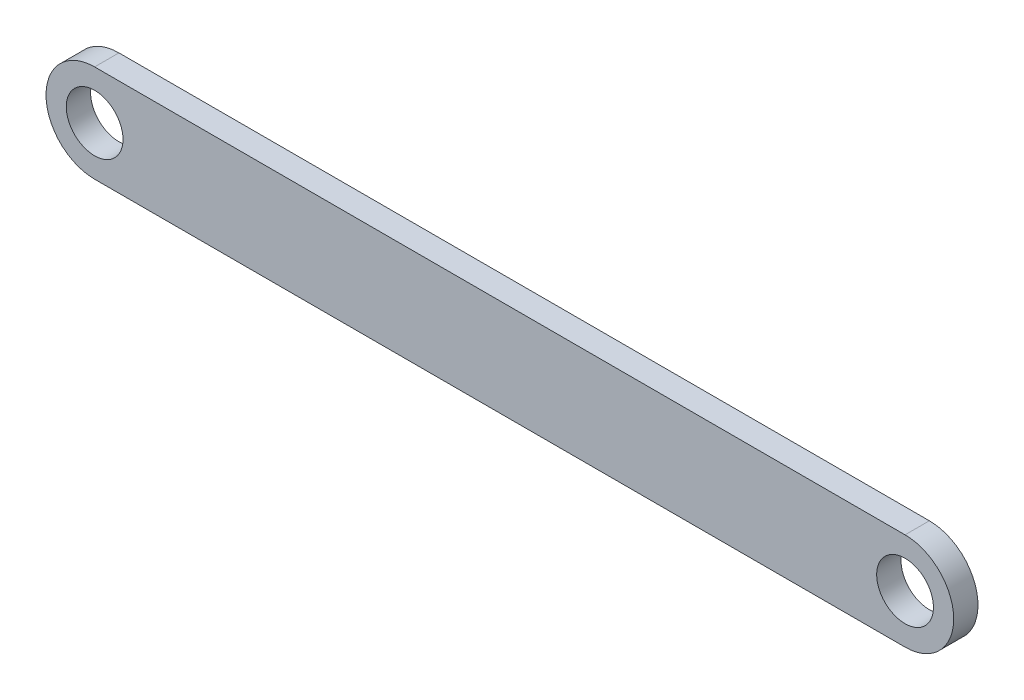
ISO-10303-21;
HEADER;
FILE_DESCRIPTION(('STEP AP214'),'2;1');
FILE_NAME('part.step','',(''),(''),'','','');
FILE_SCHEMA(('AUTOMOTIVE_DESIGN { 1 0 10303 214 1 1 1 1 }'));
ENDSEC;
DATA;
#1=APPLICATION_CONTEXT('core data for automotive mechanical design processes');
#2=APPLICATION_PROTOCOL_DEFINITION('international standard','automotive_design',2000,#1);
#3=PRODUCT_CONTEXT('',#1,'mechanical');
#4=PRODUCT('Part','Part','',(#3));
#5=PRODUCT_RELATED_PRODUCT_CATEGORY('part','',(#4));
#6=PRODUCT_DEFINITION_FORMATION('','',#4);
#7=PRODUCT_DEFINITION_CONTEXT('part definition',#1,'design');
#8=PRODUCT_DEFINITION('design','',#6,#7);
#9=PRODUCT_DEFINITION_SHAPE('','',#8);
#10=(LENGTH_UNIT() NAMED_UNIT(*) SI_UNIT(.MILLI.,.METRE.));
#11=(NAMED_UNIT(*) PLANE_ANGLE_UNIT() SI_UNIT($,.RADIAN.));
#12=(NAMED_UNIT(*) SI_UNIT($,.STERADIAN.) SOLID_ANGLE_UNIT());
#13=UNCERTAINTY_MEASURE_WITH_UNIT(LENGTH_MEASURE(1.E-05),#10,'distance_accuracy_value','');
#14=(GEOMETRIC_REPRESENTATION_CONTEXT(3) GLOBAL_UNCERTAINTY_ASSIGNED_CONTEXT((#13)) GLOBAL_UNIT_ASSIGNED_CONTEXT((#10,
#11,#12)) REPRESENTATION_CONTEXT('',''));
#15=CARTESIAN_POINT('',(0.,0.,0.));
#16=DIRECTION('',(0.,0.,1.));
#17=DIRECTION('',(1.,0.,0.));
#18=AXIS2_PLACEMENT_3D('',#15,#16,#17);
#19=CARTESIAN_POINT('',(-50.,0.,3.));
#20=DIRECTION('',(0.,0.,1.));
#21=DIRECTION('',(1.,0.,0.));
#22=AXIS2_PLACEMENT_3D('',#19,#20,#21);
#23=PLANE('',#22);
#24=CARTESIAN_POINT('',(50.,0.,3.));
#25=DIRECTION('',(0.,0.,1.));
#26=DIRECTION('',(1.,0.,0.));
#27=AXIS2_PLACEMENT_3D('',#24,#25,#26);
#28=CIRCLE('',#27,3.5);
#29=CARTESIAN_POINT('',(53.5,0.,3.));
#30=VERTEX_POINT('',#29);
#31=EDGE_CURVE('E100',#30,#30,#28,.T.);
#32=ORIENTED_EDGE('',*,*,#31,.F.);
#33=EDGE_LOOP('',(#32));
#34=FACE_BOUND('',#33,.T.);
#35=CARTESIAN_POINT('',(-50.,0.,3.));
#36=DIRECTION('',(0.,0.,1.));
#37=DIRECTION('',(1.,0.,0.));
#38=AXIS2_PLACEMENT_3D('',#35,#36,#37);
#39=CIRCLE('',#38,6.00000000000002);
#40=CARTESIAN_POINT('',(-50.,6.00000000000002,3.));
#41=VERTEX_POINT('',#40);
#42=CARTESIAN_POINT('',(-50.,-6.00000000000002,3.));
#43=VERTEX_POINT('',#42);
#44=EDGE_CURVE('E85',#41,#43,#39,.T.);
#45=ORIENTED_EDGE('',*,*,#44,.T.);
#46=DIRECTION('',(1.,0.,0.));
#47=VECTOR('',#46,1.);
#48=CARTESIAN_POINT('',(-50.,-6.00000000000002,3.));
#49=LINE('',#48,#47);
#50=CARTESIAN_POINT('',(50.,-6.00000000000002,3.));
#51=VERTEX_POINT('',#50);
#52=EDGE_CURVE('E80',#43,#51,#49,.T.);
#53=ORIENTED_EDGE('',*,*,#52,.T.);
#54=CARTESIAN_POINT('',(50.,0.,3.));
#55=DIRECTION('',(0.,0.,1.));
#56=DIRECTION('',(1.,0.,0.));
#57=AXIS2_PLACEMENT_3D('',#54,#55,#56);
#58=CIRCLE('',#57,6.00000000000002);
#59=CARTESIAN_POINT('',(50.,6.00000000000002,3.));
#60=VERTEX_POINT('',#59);
#61=EDGE_CURVE('E83',#51,#60,#58,.T.);
#62=ORIENTED_EDGE('',*,*,#61,.T.);
#63=DIRECTION('',(-1.,0.,0.));
#64=VECTOR('',#63,1.);
#65=CARTESIAN_POINT('',(-50.,6.00000000000002,3.));
#66=LINE('',#65,#64);
#67=EDGE_CURVE('E50',#60,#41,#66,.T.);
#68=ORIENTED_EDGE('',*,*,#67,.T.);
#69=EDGE_LOOP('',(#45,#53,#62,#68));
#70=FACE_BOUND('',#69,.T.);
#71=CARTESIAN_POINT('',(-50.,0.,3.));
#72=DIRECTION('',(0.,0.,1.));
#73=DIRECTION('',(1.,0.,0.));
#74=AXIS2_PLACEMENT_3D('',#71,#72,#73);
#75=CIRCLE('',#74,3.5);
#76=CARTESIAN_POINT('',(-46.5,0.,3.));
#77=VERTEX_POINT('',#76);
#78=EDGE_CURVE('E115',#77,#77,#75,.T.);
#79=ORIENTED_EDGE('',*,*,#78,.F.);
#80=EDGE_LOOP('',(#79));
#81=FACE_BOUND('',#80,.T.);
#82=ADVANCED_FACE('F33',(#34,#70,#81),#23,.T.);
#83=CARTESIAN_POINT('',(-50.,0.,0.));
#84=DIRECTION('',(0.,0.,1.));
#85=DIRECTION('',(1.,0.,0.));
#86=AXIS2_PLACEMENT_3D('',#83,#84,#85);
#87=PLANE('',#86);
#88=CARTESIAN_POINT('',(-50.,0.,0.));
#89=DIRECTION('',(0.,0.,1.));
#90=DIRECTION('',(1.,0.,0.));
#91=AXIS2_PLACEMENT_3D('',#88,#89,#90);
#92=CIRCLE('',#91,6.00000000000002);
#93=CARTESIAN_POINT('',(-50.,6.00000000000002,0.));
#94=VERTEX_POINT('',#93);
#95=CARTESIAN_POINT('',(-50.,-6.00000000000002,0.));
#96=VERTEX_POINT('',#95);
#97=EDGE_CURVE('E97',#94,#96,#92,.T.);
#98=ORIENTED_EDGE('',*,*,#97,.F.);
#99=DIRECTION('',(-1.,0.,0.));
#100=VECTOR('',#99,1.);
#101=CARTESIAN_POINT('',(-50.,6.00000000000002,0.));
#102=LINE('',#101,#100);
#103=CARTESIAN_POINT('',(50.,6.00000000000002,0.));
#104=VERTEX_POINT('',#103);
#105=EDGE_CURVE('E73',#104,#94,#102,.T.);
#106=ORIENTED_EDGE('',*,*,#105,.F.);
#107=CARTESIAN_POINT('',(50.,0.,0.));
#108=DIRECTION('',(0.,0.,1.));
#109=DIRECTION('',(1.,0.,0.));
#110=AXIS2_PLACEMENT_3D('',#107,#108,#109);
#111=CIRCLE('',#110,6.00000000000002);
#112=CARTESIAN_POINT('',(50.,-6.00000000000002,0.));
#113=VERTEX_POINT('',#112);
#114=EDGE_CURVE('E67',#113,#104,#111,.T.);
#115=ORIENTED_EDGE('',*,*,#114,.F.);
#116=DIRECTION('',(1.,0.,0.));
#117=VECTOR('',#116,1.);
#118=CARTESIAN_POINT('',(-50.,-6.00000000000002,0.));
#119=LINE('',#118,#117);
#120=EDGE_CURVE('E89',#96,#113,#119,.T.);
#121=ORIENTED_EDGE('',*,*,#120,.F.);
#122=EDGE_LOOP('',(#98,#106,#115,#121));
#123=FACE_BOUND('',#122,.T.);
#124=CARTESIAN_POINT('',(50.,0.,0.));
#125=DIRECTION('',(0.,0.,1.));
#126=DIRECTION('',(1.,0.,0.));
#127=AXIS2_PLACEMENT_3D('',#124,#125,#126);
#128=CIRCLE('',#127,3.5);
#129=CARTESIAN_POINT('',(53.5,0.,0.));
#130=VERTEX_POINT('',#129);
#131=EDGE_CURVE('E112',#130,#130,#128,.T.);
#132=ORIENTED_EDGE('',*,*,#131,.T.);
#133=EDGE_LOOP('',(#132));
#134=FACE_BOUND('',#133,.T.);
#135=CARTESIAN_POINT('',(-50.,0.,0.));
#136=DIRECTION('',(0.,0.,1.));
#137=DIRECTION('',(1.,0.,0.));
#138=AXIS2_PLACEMENT_3D('',#135,#136,#137);
#139=CIRCLE('',#138,3.5);
#140=CARTESIAN_POINT('',(-46.5,0.,0.));
#141=VERTEX_POINT('',#140);
#142=EDGE_CURVE('E118',#141,#141,#139,.T.);
#143=ORIENTED_EDGE('',*,*,#142,.T.);
#144=EDGE_LOOP('',(#143));
#145=FACE_BOUND('',#144,.T.);
#146=ADVANCED_FACE('F108',(#123,#134,#145),#87,.F.);
#147=CARTESIAN_POINT('',(-50.,0.,3.));
#148=DIRECTION('',(0.,0.,-1.));
#149=DIRECTION('',(-1.,0.,0.));
#150=AXIS2_PLACEMENT_3D('',#147,#148,#149);
#151=CYLINDRICAL_SURFACE('',#150,6.00000000000002);
#152=ORIENTED_EDGE('',*,*,#97,.T.);
#153=DIRECTION('',(0.,0.,-1.));
#154=VECTOR('',#153,1.);
#155=CARTESIAN_POINT('',(-50.,-6.00000000000002,3.));
#156=LINE('',#155,#154);
#157=EDGE_CURVE('E11',#43,#96,#156,.T.);
#158=ORIENTED_EDGE('',*,*,#157,.F.);
#159=ORIENTED_EDGE('',*,*,#44,.F.);
#160=DIRECTION('',(0.,0.,-1.));
#161=VECTOR('',#160,1.);
#162=CARTESIAN_POINT('',(-50.,6.00000000000002,3.));
#163=LINE('',#162,#161);
#164=EDGE_CURVE('E93',#41,#94,#163,.T.);
#165=ORIENTED_EDGE('',*,*,#164,.T.);
#166=EDGE_LOOP('',(#152,#158,#159,#165));
#167=FACE_BOUND('',#166,.T.);
#168=ADVANCED_FACE('F35',(#167),#151,.T.);
#169=CARTESIAN_POINT('',(-50.,-6.00000000000002,3.));
#170=DIRECTION('',(0.,1.,0.));
#171=DIRECTION('',(0.,0.,1.));
#172=AXIS2_PLACEMENT_3D('',#169,#170,#171);
#173=PLANE('',#172);
#174=ORIENTED_EDGE('',*,*,#120,.T.);
#175=DIRECTION('',(0.,0.,-1.));
#176=VECTOR('',#175,1.);
#177=CARTESIAN_POINT('',(50.,-6.00000000000002,3.));
#178=LINE('',#177,#176);
#179=EDGE_CURVE('E42',#51,#113,#178,.T.);
#180=ORIENTED_EDGE('',*,*,#179,.F.);
#181=ORIENTED_EDGE('',*,*,#52,.F.);
#182=ORIENTED_EDGE('',*,*,#157,.T.);
#183=EDGE_LOOP('',(#174,#180,#181,#182));
#184=FACE_BOUND('',#183,.T.);
#185=ADVANCED_FACE('F88',(#184),#173,.F.);
#186=CARTESIAN_POINT('',(50.,0.,3.));
#187=DIRECTION('',(0.,0.,-1.));
#188=DIRECTION('',(-1.,0.,0.));
#189=AXIS2_PLACEMENT_3D('',#186,#187,#188);
#190=CYLINDRICAL_SURFACE('',#189,6.00000000000002);
#191=ORIENTED_EDGE('',*,*,#114,.T.);
#192=DIRECTION('',(0.,0.,-1.));
#193=VECTOR('',#192,1.);
#194=CARTESIAN_POINT('',(50.,6.00000000000002,3.));
#195=LINE('',#194,#193);
#196=EDGE_CURVE('E90',#60,#104,#195,.T.);
#197=ORIENTED_EDGE('',*,*,#196,.F.);
#198=ORIENTED_EDGE('',*,*,#61,.F.);
#199=ORIENTED_EDGE('',*,*,#179,.T.);
#200=EDGE_LOOP('',(#191,#197,#198,#199));
#201=FACE_BOUND('',#200,.T.);
#202=ADVANCED_FACE('F91',(#201),#190,.T.);
#203=CARTESIAN_POINT('',(-50.,6.00000000000002,3.));
#204=DIRECTION('',(0.,-1.,0.));
#205=DIRECTION('',(1.,0.,0.));
#206=AXIS2_PLACEMENT_3D('',#203,#204,#205);
#207=PLANE('',#206);
#208=ORIENTED_EDGE('',*,*,#105,.T.);
#209=ORIENTED_EDGE('',*,*,#164,.F.);
#210=ORIENTED_EDGE('',*,*,#67,.F.);
#211=ORIENTED_EDGE('',*,*,#196,.T.);
#212=EDGE_LOOP('',(#208,#209,#210,#211));
#213=FACE_BOUND('',#212,.T.);
#214=ADVANCED_FACE('F105',(#213),#207,.F.);
#215=CARTESIAN_POINT('',(50.,0.,3.));
#216=DIRECTION('',(0.,0.,-1.));
#217=DIRECTION('',(-1.,0.,0.));
#218=AXIS2_PLACEMENT_3D('',#215,#216,#217);
#219=CYLINDRICAL_SURFACE('',#218,3.5);
#220=ORIENTED_EDGE('',*,*,#31,.T.);
#221=EDGE_LOOP('',(#220));
#222=FACE_BOUND('',#221,.T.);
#223=ORIENTED_EDGE('',*,*,#131,.F.);
#224=EDGE_LOOP('',(#223));
#225=FACE_BOUND('',#224,.T.);
#226=ADVANCED_FACE('F135',(#222,#225),#219,.F.);
#227=CARTESIAN_POINT('',(-50.,0.,3.));
#228=DIRECTION('',(0.,0.,-1.));
#229=DIRECTION('',(-1.,0.,0.));
#230=AXIS2_PLACEMENT_3D('',#227,#228,#229);
#231=CYLINDRICAL_SURFACE('',#230,3.5);
#232=ORIENTED_EDGE('',*,*,#78,.T.);
#233=EDGE_LOOP('',(#232));
#234=FACE_BOUND('',#233,.T.);
#235=ORIENTED_EDGE('',*,*,#142,.F.);
#236=EDGE_LOOP('',(#235));
#237=FACE_BOUND('',#236,.T.);
#238=ADVANCED_FACE('F124',(#234,#237),#231,.F.);
#239=CLOSED_SHELL('',(#82,#146,#168,#185,#202,#214,#226,#238));
#240=MANIFOLD_SOLID_BREP('B2',#239);
#241=ADVANCED_BREP_SHAPE_REPRESENTATION('',(#18,#240),#14);
#242=SHAPE_DEFINITION_REPRESENTATION(#9,#241);
ENDSEC;
END-ISO-10303-21;
